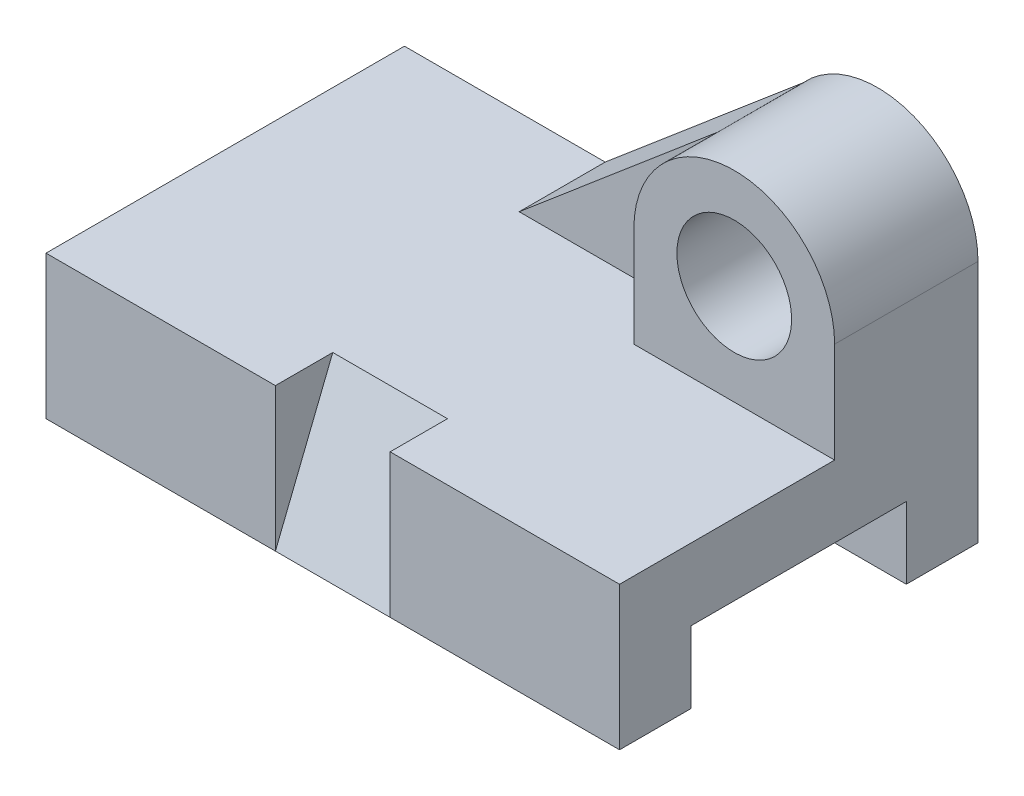
ISO-10303-21;
HEADER;
FILE_DESCRIPTION(('STEP AP214'),'2;1');
FILE_NAME('part.step','',(''),(''),'','','');
FILE_SCHEMA(('AUTOMOTIVE_DESIGN { 1 0 10303 214 1 1 1 1 }'));
ENDSEC;
DATA;
#1=APPLICATION_CONTEXT('core data for automotive mechanical design processes');
#2=APPLICATION_PROTOCOL_DEFINITION('international standard','automotive_design',2000,#1);
#3=PRODUCT_CONTEXT('',#1,'mechanical');
#4=PRODUCT('Part','Part','',(#3));
#5=PRODUCT_RELATED_PRODUCT_CATEGORY('part','',(#4));
#6=PRODUCT_DEFINITION_FORMATION('','',#4);
#7=PRODUCT_DEFINITION_CONTEXT('part definition',#1,'design');
#8=PRODUCT_DEFINITION('design','',#6,#7);
#9=PRODUCT_DEFINITION_SHAPE('','',#8);
#10=(LENGTH_UNIT() NAMED_UNIT(*) SI_UNIT(.MILLI.,.METRE.));
#11=(NAMED_UNIT(*) PLANE_ANGLE_UNIT() SI_UNIT($,.RADIAN.));
#12=(NAMED_UNIT(*) SI_UNIT($,.STERADIAN.) SOLID_ANGLE_UNIT());
#13=UNCERTAINTY_MEASURE_WITH_UNIT(LENGTH_MEASURE(1.E-05),#10,'distance_accuracy_value','');
#14=(GEOMETRIC_REPRESENTATION_CONTEXT(3) GLOBAL_UNCERTAINTY_ASSIGNED_CONTEXT((#13)) GLOBAL_UNIT_ASSIGNED_CONTEXT((#10,
#11,#12)) REPRESENTATION_CONTEXT('',''));
#15=CARTESIAN_POINT('',(0.,0.,0.));
#16=DIRECTION('',(0.,0.,1.));
#17=DIRECTION('',(1.,0.,0.));
#18=AXIS2_PLACEMENT_3D('',#15,#16,#17);
#19=CARTESIAN_POINT('',(-20.,0.,42.5));
#20=DIRECTION('',(-1.,0.,0.));
#21=DIRECTION('',(0.,0.,1.));
#22=AXIS2_PLACEMENT_3D('',#19,#20,#21);
#23=PLANE('',#22);
#24=DIRECTION('',(0.,0.928476690885259,-0.371390676354104));
#25=VECTOR('',#24,1.);
#26=CARTESIAN_POINT('',(-20.,50.,42.5));
#27=LINE('',#26,#25);
#28=CARTESIAN_POINT('',(-20.,0.,62.5));
#29=VERTEX_POINT('',#28);
#30=CARTESIAN_POINT('',(-20.,50.,42.5));
#31=VERTEX_POINT('',#30);
#32=EDGE_CURVE('E179',#29,#31,#27,.T.);
#33=ORIENTED_EDGE('',*,*,#32,.T.);
#34=DIRECTION('',(0.,0.,1.));
#35=VECTOR('',#34,1.);
#36=CARTESIAN_POINT('',(-20.,50.,42.5));
#37=LINE('',#36,#35);
#38=CARTESIAN_POINT('',(-20.,50.,62.5));
#39=VERTEX_POINT('',#38);
#40=EDGE_CURVE('E164',#31,#39,#37,.T.);
#41=ORIENTED_EDGE('',*,*,#40,.T.);
#42=DIRECTION('',(0.,-1.,0.));
#43=VECTOR('',#42,1.);
#44=CARTESIAN_POINT('',(-20.,0.,62.5));
#45=LINE('',#44,#43);
#46=EDGE_CURVE('E180',#39,#29,#45,.T.);
#47=ORIENTED_EDGE('',*,*,#46,.T.);
#48=EDGE_LOOP('',(#33,#41,#47));
#49=FACE_BOUND('',#48,.T.);
#50=ADVANCED_FACE('F40',(#49),#23,.F.);
#51=CARTESIAN_POINT('',(20.,50.,42.5));
#52=DIRECTION('',(1.,0.,0.));
#53=DIRECTION('',(0.,1.,0.));
#54=AXIS2_PLACEMENT_3D('',#51,#52,#53);
#55=PLANE('',#54);
#56=DIRECTION('',(0.,0.928476690885259,-0.371390676354104));
#57=VECTOR('',#56,1.);
#58=CARTESIAN_POINT('',(20.,50.,42.5));
#59=LINE('',#58,#57);
#60=CARTESIAN_POINT('',(20.,0.,62.5));
#61=VERTEX_POINT('',#60);
#62=CARTESIAN_POINT('',(20.,50.,42.5));
#63=VERTEX_POINT('',#62);
#64=EDGE_CURVE('E186',#61,#63,#59,.T.);
#65=ORIENTED_EDGE('',*,*,#64,.F.);
#66=DIRECTION('',(0.,1.,0.));
#67=VECTOR('',#66,1.);
#68=CARTESIAN_POINT('',(20.,50.,62.5));
#69=LINE('',#68,#67);
#70=CARTESIAN_POINT('',(20.,50.,62.5));
#71=VERTEX_POINT('',#70);
#72=EDGE_CURVE('E194',#61,#71,#69,.T.);
#73=ORIENTED_EDGE('',*,*,#72,.T.);
#74=DIRECTION('',(0.,0.,1.));
#75=VECTOR('',#74,1.);
#76=CARTESIAN_POINT('',(20.,50.,42.5));
#77=LINE('',#76,#75);
#78=EDGE_CURVE('E176',#63,#71,#77,.T.);
#79=ORIENTED_EDGE('',*,*,#78,.F.);
#80=EDGE_LOOP('',(#65,#73,#79));
#81=FACE_BOUND('',#80,.T.);
#82=ADVANCED_FACE('F368',(#81),#55,.F.);
#83=CARTESIAN_POINT('',(-100.,50.,62.5));
#84=DIRECTION('',(0.,0.,-1.));
#85=DIRECTION('',(-1.,0.,0.));
#86=AXIS2_PLACEMENT_3D('',#83,#84,#85);
#87=PLANE('',#86);
#88=DIRECTION('',(1.,0.,0.));
#89=VECTOR('',#88,1.);
#90=CARTESIAN_POINT('',(-100.,0.,62.5));
#91=LINE('',#90,#89);
#92=CARTESIAN_POINT('',(-100.,0.,62.5));
#93=VERTEX_POINT('',#92);
#94=EDGE_CURVE('E303',#93,#29,#91,.T.);
#95=ORIENTED_EDGE('',*,*,#94,.T.);
#96=ORIENTED_EDGE('',*,*,#46,.F.);
#97=DIRECTION('',(1.,0.,0.));
#98=VECTOR('',#97,1.);
#99=CARTESIAN_POINT('',(-100.,50.,62.5));
#100=LINE('',#99,#98);
#101=CARTESIAN_POINT('',(-100.,50.,62.5));
#102=VERTEX_POINT('',#101);
#103=EDGE_CURVE('E171',#102,#39,#100,.T.);
#104=ORIENTED_EDGE('',*,*,#103,.F.);
#105=DIRECTION('',(0.,-1.,0.));
#106=VECTOR('',#105,1.);
#107=CARTESIAN_POINT('',(-100.,50.,62.5));
#108=LINE('',#107,#106);
#109=EDGE_CURVE('E328',#102,#93,#108,.T.);
#110=ORIENTED_EDGE('',*,*,#109,.T.);
#111=EDGE_LOOP('',(#95,#96,#104,#110));
#112=FACE_BOUND('',#111,.T.);
#113=ADVANCED_FACE('F365',(#112),#87,.F.);
#114=CARTESIAN_POINT('',(30.,85.,-12.5));
#115=DIRECTION('',(-1.,0.,0.));
#116=DIRECTION('',(0.,0.,1.));
#117=AXIS2_PLACEMENT_3D('',#114,#115,#116);
#118=PLANE('',#117);
#119=DIRECTION('',(0.,0.,-1.));
#120=VECTOR('',#119,1.);
#121=CARTESIAN_POINT('',(30.,85.,-12.5));
#122=LINE('',#121,#120);
#123=CARTESIAN_POINT('',(30.,85.,-12.5));
#124=VERTEX_POINT('',#123);
#125=CARTESIAN_POINT('',(30.,85.,-32.5));
#126=VERTEX_POINT('',#125);
#127=EDGE_CURVE('E293',#124,#126,#122,.T.);
#128=ORIENTED_EDGE('',*,*,#127,.T.);
#129=DIRECTION('',(0.,-1.,0.));
#130=VECTOR('',#129,1.);
#131=CARTESIAN_POINT('',(30.,50.,-32.5));
#132=LINE('',#131,#130);
#133=CARTESIAN_POINT('',(30.,50.,-32.5));
#134=VERTEX_POINT('',#133);
#135=EDGE_CURVE('E205',#126,#134,#132,.T.);
#136=ORIENTED_EDGE('',*,*,#135,.T.);
#137=DIRECTION('',(0.,0.,-1.));
#138=VECTOR('',#137,1.);
#139=CARTESIAN_POINT('',(30.,50.,-12.5));
#140=LINE('',#139,#138);
#141=CARTESIAN_POINT('',(30.,50.,-12.5));
#142=VERTEX_POINT('',#141);
#143=EDGE_CURVE('E285',#142,#134,#140,.T.);
#144=ORIENTED_EDGE('',*,*,#143,.F.);
#145=DIRECTION('',(0.,1.,0.));
#146=VECTOR('',#145,1.);
#147=CARTESIAN_POINT('',(30.,85.,-12.5));
#148=LINE('',#147,#146);
#149=EDGE_CURVE('E273',#142,#124,#148,.T.);
#150=ORIENTED_EDGE('',*,*,#149,.T.);
#151=EDGE_LOOP('',(#128,#136,#144,#150));
#152=FACE_BOUND('',#151,.T.);
#153=ADVANCED_FACE('F367',(#152),#118,.T.);
#154=CARTESIAN_POINT('',(0.,0.,0.));
#155=DIRECTION('',(0.,-1.,0.));
#156=DIRECTION('',(0.,0.,-1.));
#157=AXIS2_PLACEMENT_3D('',#154,#155,#156);
#158=PLANE('',#157);
#159=DIRECTION('',(-1.,0.,0.));
#160=VECTOR('',#159,1.);
#161=CARTESIAN_POINT('',(100.,0.,-37.5));
#162=LINE('',#161,#160);
#163=CARTESIAN_POINT('',(100.,0.,-37.5));
#164=VERTEX_POINT('',#163);
#165=CARTESIAN_POINT('',(-100.,0.,-37.5));
#166=VERTEX_POINT('',#165);
#167=EDGE_CURVE('E238',#164,#166,#162,.T.);
#168=ORIENTED_EDGE('',*,*,#167,.T.);
#169=DIRECTION('',(0.,0.,1.));
#170=VECTOR('',#169,1.);
#171=CARTESIAN_POINT('',(-100.,0.,62.5));
#172=LINE('',#171,#170);
#173=CARTESIAN_POINT('',(-100.,0.,-62.5));
#174=VERTEX_POINT('',#173);
#175=EDGE_CURVE('E320',#174,#166,#172,.T.);
#176=ORIENTED_EDGE('',*,*,#175,.F.);
#177=DIRECTION('',(-1.,0.,0.));
#178=VECTOR('',#177,1.);
#179=CARTESIAN_POINT('',(-100.,0.,-62.5));
#180=LINE('',#179,#178);
#181=CARTESIAN_POINT('',(100.,0.,-62.5));
#182=VERTEX_POINT('',#181);
#183=EDGE_CURVE('E316',#182,#174,#180,.T.);
#184=ORIENTED_EDGE('',*,*,#183,.F.);
#185=DIRECTION('',(0.,0.,-1.));
#186=VECTOR('',#185,1.);
#187=CARTESIAN_POINT('',(100.,0.,62.5));
#188=LINE('',#187,#186);
#189=EDGE_CURVE('E292',#164,#182,#188,.T.);
#190=ORIENTED_EDGE('',*,*,#189,.F.);
#191=EDGE_LOOP('',(#168,#176,#184,#190));
#192=FACE_BOUND('',#191,.T.);
#193=ADVANCED_FACE('F342',(#192),#158,.T.);
#194=CARTESIAN_POINT('',(100.,50.,62.5));
#195=DIRECTION('',(-1.,0.,0.));
#196=DIRECTION('',(0.,0.,1.));
#197=AXIS2_PLACEMENT_3D('',#194,#195,#196);
#198=PLANE('',#197);
#199=DIRECTION('',(0.,0.,-1.));
#200=VECTOR('',#199,1.);
#201=CARTESIAN_POINT('',(100.,25.,-37.5));
#202=LINE('',#201,#200);
#203=CARTESIAN_POINT('',(100.,25.,37.5));
#204=VERTEX_POINT('',#203);
#205=CARTESIAN_POINT('',(100.,25.,-37.5));
#206=VERTEX_POINT('',#205);
#207=EDGE_CURVE('E234',#204,#206,#202,.T.);
#208=ORIENTED_EDGE('',*,*,#207,.T.);
#209=DIRECTION('',(0.,-1.,0.));
#210=VECTOR('',#209,1.);
#211=CARTESIAN_POINT('',(100.,0.,-37.5));
#212=LINE('',#211,#210);
#213=EDGE_CURVE('E227',#206,#164,#212,.T.);
#214=ORIENTED_EDGE('',*,*,#213,.T.);
#215=ORIENTED_EDGE('',*,*,#189,.T.);
#216=DIRECTION('',(0.,-1.,0.));
#217=VECTOR('',#216,1.);
#218=CARTESIAN_POINT('',(100.,50.,-62.5));
#219=LINE('',#218,#217);
#220=CARTESIAN_POINT('',(100.,85.,-62.5));
#221=VERTEX_POINT('',#220);
#222=EDGE_CURVE('E11',#221,#182,#219,.T.);
#223=ORIENTED_EDGE('',*,*,#222,.F.);
#224=DIRECTION('',(0.,0.,-1.));
#225=VECTOR('',#224,1.);
#226=CARTESIAN_POINT('',(100.,85.,-12.5));
#227=LINE('',#226,#225);
#228=CARTESIAN_POINT('',(100.,85.,-12.5));
#229=VERTEX_POINT('',#228);
#230=EDGE_CURVE('E288',#229,#221,#227,.T.);
#231=ORIENTED_EDGE('',*,*,#230,.F.);
#232=DIRECTION('',(0.,-1.,0.));
#233=VECTOR('',#232,1.);
#234=CARTESIAN_POINT('',(100.,50.,-12.5));
#235=LINE('',#234,#233);
#236=CARTESIAN_POINT('',(100.,50.,-12.5));
#237=VERTEX_POINT('',#236);
#238=EDGE_CURVE('E281',#229,#237,#235,.T.);
#239=ORIENTED_EDGE('',*,*,#238,.T.);
#240=DIRECTION('',(0.,0.,-1.));
#241=VECTOR('',#240,1.);
#242=CARTESIAN_POINT('',(100.,50.,62.5));
#243=LINE('',#242,#241);
#244=CARTESIAN_POINT('',(100.,50.,62.5));
#245=VERTEX_POINT('',#244);
#246=EDGE_CURVE('E300',#245,#237,#243,.T.);
#247=ORIENTED_EDGE('',*,*,#246,.F.);
#248=DIRECTION('',(0.,-1.,0.));
#249=VECTOR('',#248,1.);
#250=CARTESIAN_POINT('',(100.,50.,62.5));
#251=LINE('',#250,#249);
#252=CARTESIAN_POINT('',(100.,0.,62.5));
#253=VERTEX_POINT('',#252);
#254=EDGE_CURVE('E311',#245,#253,#251,.T.);
#255=ORIENTED_EDGE('',*,*,#254,.T.);
#256=CARTESIAN_POINT('',(100.,0.,37.5));
#257=VERTEX_POINT('',#256);
#258=EDGE_CURVE('E312',#253,#257,#188,.T.);
#259=ORIENTED_EDGE('',*,*,#258,.T.);
#260=DIRECTION('',(0.,1.,0.));
#261=VECTOR('',#260,1.);
#262=CARTESIAN_POINT('',(100.,0.,37.5));
#263=LINE('',#262,#261);
#264=EDGE_CURVE('E56',#257,#204,#263,.T.);
#265=ORIENTED_EDGE('',*,*,#264,.T.);
#266=EDGE_LOOP('',(#208,#214,#215,#223,#231,#239,#247,#255,#259,#265));
#267=FACE_BOUND('',#266,.T.);
#268=ADVANCED_FACE('F42',(#267),#198,.F.);
#269=CARTESIAN_POINT('',(-100.,50.,-62.5));
#270=DIRECTION('',(0.,0.,1.));
#271=DIRECTION('',(1.,0.,0.));
#272=AXIS2_PLACEMENT_3D('',#269,#270,#271);
#273=PLANE('',#272);
#274=DIRECTION('',(-1.,0.,0.));
#275=VECTOR('',#274,1.);
#276=CARTESIAN_POINT('',(-100.,50.,-62.5));
#277=LINE('',#276,#275);
#278=CARTESIAN_POINT('',(-30.,50.,-62.5));
#279=VERTEX_POINT('',#278);
#280=CARTESIAN_POINT('',(-100.,50.,-62.5));
#281=VERTEX_POINT('',#280);
#282=EDGE_CURVE('E91',#279,#281,#277,.T.);
#283=ORIENTED_EDGE('',*,*,#282,.F.);
#284=DIRECTION('',(0.762982683726246,0.646418923248612,0.));
#285=VECTOR('',#284,1.);
#286=CARTESIAN_POINT('',(39.1082758098269,108.550342215348,-62.5));
#287=LINE('',#286,#285);
#288=CARTESIAN_POINT('',(39.1082758098269,108.550342215348,-62.5));
#289=VERTEX_POINT('',#288);
#290=EDGE_CURVE('E175',#279,#289,#287,.T.);
#291=ORIENTED_EDGE('',*,*,#290,.T.);
#292=CARTESIAN_POINT('',(65.,85.,-62.5));
#293=DIRECTION('',(0.,0.,-1.));
#294=DIRECTION('',(1.,0.,0.));
#295=AXIS2_PLACEMENT_3D('',#292,#293,#294);
#296=CIRCLE('',#295,35.);
#297=EDGE_CURVE('E265',#289,#221,#296,.T.);
#298=ORIENTED_EDGE('',*,*,#297,.T.);
#299=ORIENTED_EDGE('',*,*,#222,.T.);
#300=ORIENTED_EDGE('',*,*,#183,.T.);
#301=DIRECTION('',(0.,-1.,0.));
#302=VECTOR('',#301,1.);
#303=CARTESIAN_POINT('',(-100.,50.,-62.5));
#304=LINE('',#303,#302);
#305=EDGE_CURVE('E49',#281,#174,#304,.T.);
#306=ORIENTED_EDGE('',*,*,#305,.F.);
#307=EDGE_LOOP('',(#283,#291,#298,#299,#300,#306));
#308=FACE_BOUND('',#307,.T.);
#309=CARTESIAN_POINT('',(65.,85.,-62.5));
#310=DIRECTION('',(0.,0.,-1.));
#311=DIRECTION('',(-1.,0.,0.));
#312=AXIS2_PLACEMENT_3D('',#309,#310,#311);
#313=CIRCLE('',#312,20.);
#314=CARTESIAN_POINT('',(45.,85.,-62.5));
#315=VERTEX_POINT('',#314);
#316=EDGE_CURVE('E251',#315,#315,#313,.T.);
#317=ORIENTED_EDGE('',*,*,#316,.F.);
#318=EDGE_LOOP('',(#317));
#319=FACE_BOUND('',#318,.T.);
#320=ADVANCED_FACE('F423',(#308,#319),#273,.F.);
#321=CARTESIAN_POINT('',(-100.,50.,62.5));
#322=DIRECTION('',(1.,0.,0.));
#323=DIRECTION('',(0.,0.,-1.));
#324=AXIS2_PLACEMENT_3D('',#321,#322,#323);
#325=PLANE('',#324);
#326=ORIENTED_EDGE('',*,*,#175,.T.);
#327=DIRECTION('',(0.,-1.,0.));
#328=VECTOR('',#327,1.);
#329=CARTESIAN_POINT('',(-100.,0.,-37.5));
#330=LINE('',#329,#328);
#331=CARTESIAN_POINT('',(-100.,25.,-37.5));
#332=VERTEX_POINT('',#331);
#333=EDGE_CURVE('E224',#332,#166,#330,.T.);
#334=ORIENTED_EDGE('',*,*,#333,.F.);
#335=DIRECTION('',(0.,0.,-1.));
#336=VECTOR('',#335,1.);
#337=CARTESIAN_POINT('',(-100.,25.,-37.5));
#338=LINE('',#337,#336);
#339=CARTESIAN_POINT('',(-100.,25.,37.5));
#340=VERTEX_POINT('',#339);
#341=EDGE_CURVE('E231',#340,#332,#338,.T.);
#342=ORIENTED_EDGE('',*,*,#341,.F.);
#343=DIRECTION('',(0.,1.,0.));
#344=VECTOR('',#343,1.);
#345=CARTESIAN_POINT('',(-100.,0.,37.5));
#346=LINE('',#345,#344);
#347=CARTESIAN_POINT('',(-100.,0.,37.5));
#348=VERTEX_POINT('',#347);
#349=EDGE_CURVE('E241',#348,#340,#346,.T.);
#350=ORIENTED_EDGE('',*,*,#349,.F.);
#351=EDGE_CURVE('E319',#348,#93,#172,.T.);
#352=ORIENTED_EDGE('',*,*,#351,.T.);
#353=ORIENTED_EDGE('',*,*,#109,.F.);
#354=DIRECTION('',(0.,0.,1.));
#355=VECTOR('',#354,1.);
#356=CARTESIAN_POINT('',(-100.,50.,62.5));
#357=LINE('',#356,#355);
#358=EDGE_CURVE('E306',#281,#102,#357,.T.);
#359=ORIENTED_EDGE('',*,*,#358,.F.);
#360=ORIENTED_EDGE('',*,*,#305,.T.);
#361=EDGE_LOOP('',(#326,#334,#342,#350,#352,#353,#359,#360));
#362=FACE_BOUND('',#361,.T.);
#363=ADVANCED_FACE('F336',(#362),#325,.F.);
#364=EDGE_CURVE('E65',#71,#245,#100,.T.);
#365=ORIENTED_EDGE('',*,*,#364,.F.);
#366=ORIENTED_EDGE('',*,*,#72,.F.);
#367=EDGE_CURVE('E86',#61,#253,#91,.T.);
#368=ORIENTED_EDGE('',*,*,#367,.T.);
#369=ORIENTED_EDGE('',*,*,#254,.F.);
#370=EDGE_LOOP('',(#365,#366,#368,#369));
#371=FACE_BOUND('',#370,.T.);
#372=ADVANCED_FACE('F370',(#371),#87,.F.);
#373=CARTESIAN_POINT('',(0.,50.,0.));
#374=DIRECTION('',(0.,-1.,0.));
#375=DIRECTION('',(0.,0.,-1.));
#376=AXIS2_PLACEMENT_3D('',#373,#374,#375);
#377=PLANE('',#376);
#378=ORIENTED_EDGE('',*,*,#103,.T.);
#379=ORIENTED_EDGE('',*,*,#40,.F.);
#380=DIRECTION('',(-1.,0.,0.));
#381=VECTOR('',#380,1.);
#382=CARTESIAN_POINT('',(-20.,50.,42.5));
#383=LINE('',#382,#381);
#384=EDGE_CURVE('E168',#63,#31,#383,.T.);
#385=ORIENTED_EDGE('',*,*,#384,.F.);
#386=ORIENTED_EDGE('',*,*,#78,.T.);
#387=ORIENTED_EDGE('',*,*,#364,.T.);
#388=ORIENTED_EDGE('',*,*,#246,.T.);
#389=DIRECTION('',(-1.,0.,0.));
#390=VECTOR('',#389,1.);
#391=CARTESIAN_POINT('',(30.,50.,-12.5));
#392=LINE('',#391,#390);
#393=EDGE_CURVE('E269',#237,#142,#392,.T.);
#394=ORIENTED_EDGE('',*,*,#393,.T.);
#395=ORIENTED_EDGE('',*,*,#143,.T.);
#396=DIRECTION('',(-1.,0.,0.));
#397=VECTOR('',#396,1.);
#398=CARTESIAN_POINT('',(-30.,50.,-32.5));
#399=LINE('',#398,#397);
#400=CARTESIAN_POINT('',(-30.,50.,-32.5));
#401=VERTEX_POINT('',#400);
#402=EDGE_CURVE('E209',#134,#401,#399,.T.);
#403=ORIENTED_EDGE('',*,*,#402,.T.);
#404=DIRECTION('',(0.,0.,-1.));
#405=VECTOR('',#404,1.);
#406=CARTESIAN_POINT('',(-30.,50.,-32.5));
#407=LINE('',#406,#405);
#408=EDGE_CURVE('E217',#401,#279,#407,.T.);
#409=ORIENTED_EDGE('',*,*,#408,.T.);
#410=ORIENTED_EDGE('',*,*,#282,.T.);
#411=ORIENTED_EDGE('',*,*,#358,.T.);
#412=EDGE_LOOP('',(#378,#379,#385,#386,#387,#388,#394,#395,#403,#409,#410,#411));
#413=FACE_BOUND('',#412,.T.);
#414=ADVANCED_FACE('F166',(#413),#377,.F.);
#415=DIRECTION('',(1.,0.,0.));
#416=VECTOR('',#415,1.);
#417=CARTESIAN_POINT('',(-20.,0.,62.5));
#418=LINE('',#417,#416);
#419=EDGE_CURVE('E185',#29,#61,#418,.T.);
#420=ORIENTED_EDGE('',*,*,#419,.F.);
#421=ORIENTED_EDGE('',*,*,#94,.F.);
#422=ORIENTED_EDGE('',*,*,#351,.F.);
#423=DIRECTION('',(-1.,0.,0.));
#424=VECTOR('',#423,1.);
#425=CARTESIAN_POINT('',(100.,0.,37.5));
#426=LINE('',#425,#424);
#427=EDGE_CURVE('E255',#257,#348,#426,.T.);
#428=ORIENTED_EDGE('',*,*,#427,.F.);
#429=ORIENTED_EDGE('',*,*,#258,.F.);
#430=ORIENTED_EDGE('',*,*,#367,.F.);
#431=EDGE_LOOP('',(#420,#421,#422,#428,#429,#430));
#432=FACE_BOUND('',#431,.T.);
#433=ADVANCED_FACE('F358',(#432),#158,.T.);
#434=CARTESIAN_POINT('',(65.,85.,-12.5));
#435=DIRECTION('',(0.,0.,-1.));
#436=DIRECTION('',(-1.,0.,0.));
#437=AXIS2_PLACEMENT_3D('',#434,#435,#436);
#438=CYLINDRICAL_SURFACE('',#437,35.);
#439=DIRECTION('',(0.,0.,-1.));
#440=VECTOR('',#439,1.);
#441=CARTESIAN_POINT('',(39.1082758098269,108.550342215348,-32.5));
#442=LINE('',#441,#440);
#443=CARTESIAN_POINT('',(39.1082758098269,108.550342215348,-32.5));
#444=VERTEX_POINT('',#443);
#445=EDGE_CURVE('E221',#444,#289,#442,.T.);
#446=ORIENTED_EDGE('',*,*,#445,.F.);
#447=CARTESIAN_POINT('',(65.0000000000001,85.,-32.5));
#448=DIRECTION('',(0.,0.,1.));
#449=DIRECTION('',(-1.,0.,0.));
#450=AXIS2_PLACEMENT_3D('',#447,#448,#449);
#451=CIRCLE('',#450,35.0000000000001);
#452=EDGE_CURVE('E201',#444,#126,#451,.T.);
#453=ORIENTED_EDGE('',*,*,#452,.T.);
#454=ORIENTED_EDGE('',*,*,#127,.F.);
#455=CARTESIAN_POINT('',(65.,85.,-12.5));
#456=DIRECTION('',(0.,0.,-1.));
#457=DIRECTION('',(1.,0.,0.));
#458=AXIS2_PLACEMENT_3D('',#455,#456,#457);
#459=CIRCLE('',#458,35.);
#460=EDGE_CURVE('E277',#124,#229,#459,.T.);
#461=ORIENTED_EDGE('',*,*,#460,.T.);
#462=ORIENTED_EDGE('',*,*,#230,.T.);
#463=ORIENTED_EDGE('',*,*,#297,.F.);
#464=EDGE_LOOP('',(#446,#453,#454,#461,#462,#463));
#465=FACE_BOUND('',#464,.T.);
#466=ADVANCED_FACE('F410',(#465),#438,.T.);
#467=CARTESIAN_POINT('',(65.,85.,-12.5));
#468=DIRECTION('',(0.,0.,1.));
#469=DIRECTION('',(1.,0.,0.));
#470=AXIS2_PLACEMENT_3D('',#467,#468,#469);
#471=PLANE('',#470);
#472=CARTESIAN_POINT('',(65.,85.,-12.5));
#473=DIRECTION('',(0.,0.,-1.));
#474=DIRECTION('',(-1.,0.,0.));
#475=AXIS2_PLACEMENT_3D('',#472,#473,#474);
#476=CIRCLE('',#475,20.);
#477=CARTESIAN_POINT('',(45.,85.,-12.5));
#478=VERTEX_POINT('',#477);
#479=EDGE_CURVE('E261',#478,#478,#476,.T.);
#480=ORIENTED_EDGE('',*,*,#479,.T.);
#481=EDGE_LOOP('',(#480));
#482=FACE_BOUND('',#481,.T.);
#483=ORIENTED_EDGE('',*,*,#393,.F.);
#484=ORIENTED_EDGE('',*,*,#238,.F.);
#485=ORIENTED_EDGE('',*,*,#460,.F.);
#486=ORIENTED_EDGE('',*,*,#149,.F.);
#487=EDGE_LOOP('',(#483,#484,#485,#486));
#488=FACE_BOUND('',#487,.T.);
#489=ADVANCED_FACE('F406',(#482,#488),#471,.T.);
#490=CARTESIAN_POINT('',(65.,85.,-12.5));
#491=DIRECTION('',(0.,0.,-1.));
#492=DIRECTION('',(-1.,0.,0.));
#493=AXIS2_PLACEMENT_3D('',#490,#491,#492);
#494=CYLINDRICAL_SURFACE('',#493,20.);
#495=ORIENTED_EDGE('',*,*,#479,.F.);
#496=EDGE_LOOP('',(#495));
#497=FACE_BOUND('',#496,.T.);
#498=ORIENTED_EDGE('',*,*,#316,.T.);
#499=EDGE_LOOP('',(#498));
#500=FACE_BOUND('',#499,.T.);
#501=ADVANCED_FACE('F403',(#497,#500),#494,.F.);
#502=CARTESIAN_POINT('',(100.,0.,-37.5));
#503=DIRECTION('',(0.,0.,-1.));
#504=DIRECTION('',(-1.,0.,0.));
#505=AXIS2_PLACEMENT_3D('',#502,#503,#504);
#506=PLANE('',#505);
#507=ORIENTED_EDGE('',*,*,#333,.T.);
#508=ORIENTED_EDGE('',*,*,#167,.F.);
#509=ORIENTED_EDGE('',*,*,#213,.F.);
#510=DIRECTION('',(-1.,0.,0.));
#511=VECTOR('',#510,1.);
#512=CARTESIAN_POINT('',(100.,25.,-37.5));
#513=LINE('',#512,#511);
#514=EDGE_CURVE('E248',#206,#332,#513,.T.);
#515=ORIENTED_EDGE('',*,*,#514,.T.);
#516=EDGE_LOOP('',(#507,#508,#509,#515));
#517=FACE_BOUND('',#516,.T.);
#518=ADVANCED_FACE('F346',(#517),#506,.F.);
#519=CARTESIAN_POINT('',(100.,25.,-37.5));
#520=DIRECTION('',(0.,1.,0.));
#521=DIRECTION('',(0.,0.,1.));
#522=AXIS2_PLACEMENT_3D('',#519,#520,#521);
#523=PLANE('',#522);
#524=ORIENTED_EDGE('',*,*,#341,.T.);
#525=ORIENTED_EDGE('',*,*,#514,.F.);
#526=ORIENTED_EDGE('',*,*,#207,.F.);
#527=DIRECTION('',(-1.,0.,0.));
#528=VECTOR('',#527,1.);
#529=CARTESIAN_POINT('',(100.,25.,37.5));
#530=LINE('',#529,#528);
#531=EDGE_CURVE('E252',#204,#340,#530,.T.);
#532=ORIENTED_EDGE('',*,*,#531,.T.);
#533=EDGE_LOOP('',(#524,#525,#526,#532));
#534=FACE_BOUND('',#533,.T.);
#535=ADVANCED_FACE('F351',(#534),#523,.F.);
#536=CARTESIAN_POINT('',(100.,0.,37.5));
#537=DIRECTION('',(0.,0.,1.));
#538=DIRECTION('',(1.,0.,0.));
#539=AXIS2_PLACEMENT_3D('',#536,#537,#538);
#540=PLANE('',#539);
#541=ORIENTED_EDGE('',*,*,#349,.T.);
#542=ORIENTED_EDGE('',*,*,#531,.F.);
#543=ORIENTED_EDGE('',*,*,#264,.F.);
#544=ORIENTED_EDGE('',*,*,#427,.T.);
#545=EDGE_LOOP('',(#541,#542,#543,#544));
#546=FACE_BOUND('',#545,.T.);
#547=ADVANCED_FACE('F395',(#546),#540,.F.);
#548=CARTESIAN_POINT('',(39.1082758098269,108.550342215348,-32.5));
#549=DIRECTION('',(-0.646418923248612,0.762982683726246,0.));
#550=DIRECTION('',(-0.762982683726246,-0.646418923248612,0.));
#551=AXIS2_PLACEMENT_3D('',#548,#549,#550);
#552=PLANE('',#551);
#553=ORIENTED_EDGE('',*,*,#290,.F.);
#554=ORIENTED_EDGE('',*,*,#408,.F.);
#555=DIRECTION('',(0.762982683726246,0.646418923248612,0.));
#556=VECTOR('',#555,1.);
#557=CARTESIAN_POINT('',(39.1082758098269,108.550342215348,-32.5));
#558=LINE('',#557,#556);
#559=EDGE_CURVE('E213',#401,#444,#558,.T.);
#560=ORIENTED_EDGE('',*,*,#559,.T.);
#561=ORIENTED_EDGE('',*,*,#445,.T.);
#562=EDGE_LOOP('',(#553,#554,#560,#561));
#563=FACE_BOUND('',#562,.T.);
#564=ADVANCED_FACE('F391',(#563),#552,.T.);
#565=CARTESIAN_POINT('',(65.0000000000001,85.,-32.5));
#566=DIRECTION('',(0.,0.,-1.));
#567=DIRECTION('',(-1.,0.,0.));
#568=AXIS2_PLACEMENT_3D('',#565,#566,#567);
#569=PLANE('',#568);
#570=ORIENTED_EDGE('',*,*,#452,.F.);
#571=ORIENTED_EDGE('',*,*,#559,.F.);
#572=ORIENTED_EDGE('',*,*,#402,.F.);
#573=ORIENTED_EDGE('',*,*,#135,.F.);
#574=EDGE_LOOP('',(#570,#571,#572,#573));
#575=FACE_BOUND('',#574,.T.);
#576=ADVANCED_FACE('F388',(#575),#569,.F.);
#577=CARTESIAN_POINT('',(-20.,50.,42.5));
#578=DIRECTION('',(0.,-0.371390676354104,-0.928476690885259));
#579=DIRECTION('',(0.,0.928476690885259,-0.371390676354104));
#580=AXIS2_PLACEMENT_3D('',#577,#578,#579);
#581=PLANE('',#580);
#582=ORIENTED_EDGE('',*,*,#64,.T.);
#583=ORIENTED_EDGE('',*,*,#384,.T.);
#584=ORIENTED_EDGE('',*,*,#32,.F.);
#585=ORIENTED_EDGE('',*,*,#419,.T.);
#586=EDGE_LOOP('',(#582,#583,#584,#585));
#587=FACE_BOUND('',#586,.T.);
#588=ADVANCED_FACE('F188',(#587),#581,.F.);
#589=CLOSED_SHELL('',(#50,#82,#113,#153,#193,#268,#320,#363,#372,#414,#433,#466,#489,#501,#518,
#535,#547,#564,#576,#588));
#590=MANIFOLD_SOLID_BREP('B2',#589);
#591=ADVANCED_BREP_SHAPE_REPRESENTATION('',(#18,#590),#14);
#592=SHAPE_DEFINITION_REPRESENTATION(#9,#591);
ENDSEC;
END-ISO-10303-21;
